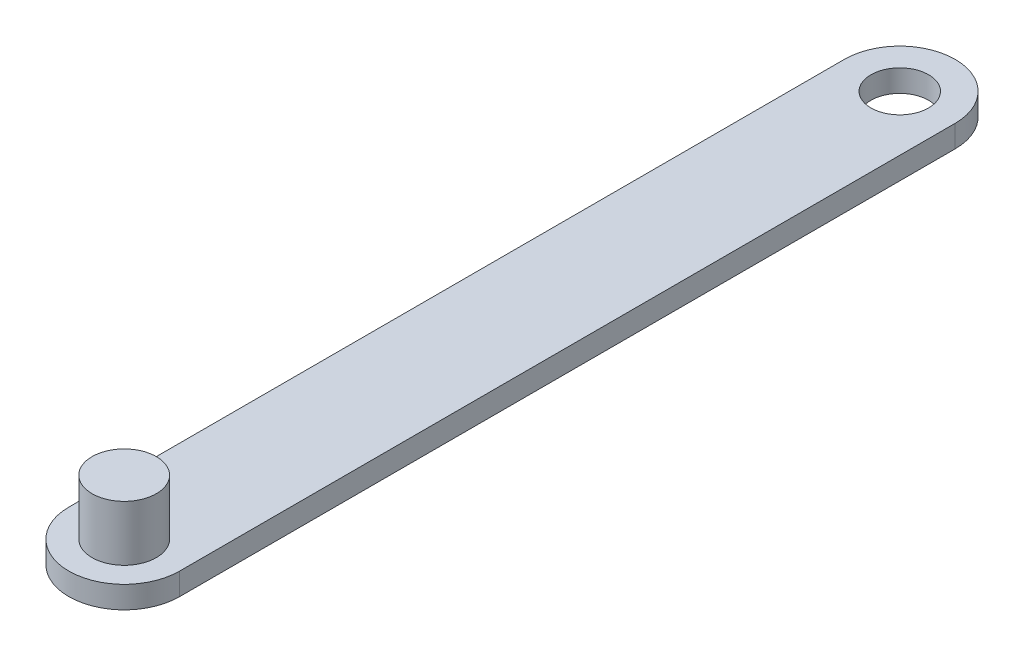
ISO-10303-21;
HEADER;
FILE_DESCRIPTION(('STEP AP214'),'2;1');
FILE_NAME('part.step','',(''),(''),'','','');
FILE_SCHEMA(('AUTOMOTIVE_DESIGN { 1 0 10303 214 1 1 1 1 }'));
ENDSEC;
DATA;
#1=APPLICATION_CONTEXT('core data for automotive mechanical design processes');
#2=APPLICATION_PROTOCOL_DEFINITION('international standard','automotive_design',2000,#1);
#3=PRODUCT_CONTEXT('',#1,'mechanical');
#4=PRODUCT('Part','Part','',(#3));
#5=PRODUCT_RELATED_PRODUCT_CATEGORY('part','',(#4));
#6=PRODUCT_DEFINITION_FORMATION('','',#4);
#7=PRODUCT_DEFINITION_CONTEXT('part definition',#1,'design');
#8=PRODUCT_DEFINITION('design','',#6,#7);
#9=PRODUCT_DEFINITION_SHAPE('','',#8);
#10=(LENGTH_UNIT() NAMED_UNIT(*) SI_UNIT(.MILLI.,.METRE.));
#11=(NAMED_UNIT(*) PLANE_ANGLE_UNIT() SI_UNIT($,.RADIAN.));
#12=(NAMED_UNIT(*) SI_UNIT($,.STERADIAN.) SOLID_ANGLE_UNIT());
#13=UNCERTAINTY_MEASURE_WITH_UNIT(LENGTH_MEASURE(1.E-05),#10,'distance_accuracy_value','');
#14=(GEOMETRIC_REPRESENTATION_CONTEXT(3) GLOBAL_UNCERTAINTY_ASSIGNED_CONTEXT((#13)) GLOBAL_UNIT_ASSIGNED_CONTEXT((#10,
#11,#12)) REPRESENTATION_CONTEXT('',''));
#15=CARTESIAN_POINT('',(0.,0.,0.));
#16=DIRECTION('',(0.,0.,1.));
#17=DIRECTION('',(1.,0.,0.));
#18=AXIS2_PLACEMENT_3D('',#15,#16,#17);
#19=CARTESIAN_POINT('',(5.,2.,0.));
#20=DIRECTION('',(0.,-1.,0.));
#21=DIRECTION('',(0.,0.,-1.));
#22=AXIS2_PLACEMENT_3D('',#19,#20,#21);
#23=CYLINDRICAL_SURFACE('',#22,5.);
#24=CARTESIAN_POINT('',(5.,0.,0.));
#25=DIRECTION('',(0.,1.,0.));
#26=DIRECTION('',(0.,0.,1.));
#27=AXIS2_PLACEMENT_3D('',#24,#25,#26);
#28=CIRCLE('',#27,5.);
#29=CARTESIAN_POINT('',(0.,0.,0.));
#30=VERTEX_POINT('',#29);
#31=CARTESIAN_POINT('',(10.,0.,0.));
#32=VERTEX_POINT('',#31);
#33=EDGE_CURVE('E102',#30,#32,#28,.T.);
#34=ORIENTED_EDGE('',*,*,#33,.T.);
#35=DIRECTION('',(0.,-1.,0.));
#36=VECTOR('',#35,1.);
#37=CARTESIAN_POINT('',(10.,2.,0.));
#38=LINE('',#37,#36);
#39=CARTESIAN_POINT('',(10.,2.,0.));
#40=VERTEX_POINT('',#39);
#41=EDGE_CURVE('E11',#40,#32,#38,.T.);
#42=ORIENTED_EDGE('',*,*,#41,.F.);
#43=CARTESIAN_POINT('',(5.,2.,0.));
#44=DIRECTION('',(0.,1.,0.));
#45=DIRECTION('',(0.,0.,1.));
#46=AXIS2_PLACEMENT_3D('',#43,#44,#45);
#47=CIRCLE('',#46,5.);
#48=CARTESIAN_POINT('',(0.,2.,0.));
#49=VERTEX_POINT('',#48);
#50=EDGE_CURVE('E90',#49,#40,#47,.T.);
#51=ORIENTED_EDGE('',*,*,#50,.F.);
#52=DIRECTION('',(0.,-1.,0.));
#53=VECTOR('',#52,1.);
#54=CARTESIAN_POINT('',(0.,2.,0.));
#55=LINE('',#54,#53);
#56=EDGE_CURVE('E98',#49,#30,#55,.T.);
#57=ORIENTED_EDGE('',*,*,#56,.T.);
#58=EDGE_LOOP('',(#34,#42,#51,#57));
#59=FACE_BOUND('',#58,.T.);
#60=ADVANCED_FACE('F39',(#59),#23,.T.);
#61=CARTESIAN_POINT('',(10.,2.,0.));
#62=DIRECTION('',(-1.,0.,0.));
#63=DIRECTION('',(0.,0.,1.));
#64=AXIS2_PLACEMENT_3D('',#61,#62,#63);
#65=PLANE('',#64);
#66=DIRECTION('',(0.,0.,-1.));
#67=VECTOR('',#66,1.);
#68=CARTESIAN_POINT('',(10.,0.,0.));
#69=LINE('',#68,#67);
#70=CARTESIAN_POINT('',(10.,0.,-70.0050477828094));
#71=VERTEX_POINT('',#70);
#72=EDGE_CURVE('E94',#32,#71,#69,.T.);
#73=ORIENTED_EDGE('',*,*,#72,.T.);
#74=DIRECTION('',(0.,-1.,0.));
#75=VECTOR('',#74,1.);
#76=CARTESIAN_POINT('',(10.,2.,-70.0050477828094));
#77=LINE('',#76,#75);
#78=CARTESIAN_POINT('',(10.,2.,-70.0050477828094));
#79=VERTEX_POINT('',#78);
#80=EDGE_CURVE('E47',#79,#71,#77,.T.);
#81=ORIENTED_EDGE('',*,*,#80,.F.);
#82=DIRECTION('',(0.,0.,-1.));
#83=VECTOR('',#82,1.);
#84=CARTESIAN_POINT('',(10.,2.,0.));
#85=LINE('',#84,#83);
#86=EDGE_CURVE('E85',#40,#79,#85,.T.);
#87=ORIENTED_EDGE('',*,*,#86,.F.);
#88=ORIENTED_EDGE('',*,*,#41,.T.);
#89=EDGE_LOOP('',(#73,#81,#87,#88));
#90=FACE_BOUND('',#89,.T.);
#91=ADVANCED_FACE('F93',(#90),#65,.F.);
#92=CARTESIAN_POINT('',(5.,2.,-70.0025238914047));
#93=DIRECTION('',(0.,-1.,0.));
#94=DIRECTION('',(0.,0.,-1.));
#95=AXIS2_PLACEMENT_3D('',#92,#93,#94);
#96=CYLINDRICAL_SURFACE('',#95,5.00000063700274);
#97=CARTESIAN_POINT('',(5.,0.,-70.0025238914047));
#98=DIRECTION('',(0.,1.,0.));
#99=DIRECTION('',(0.,0.,1.));
#100=AXIS2_PLACEMENT_3D('',#97,#98,#99);
#101=CIRCLE('',#100,5.00000063700274);
#102=CARTESIAN_POINT('',(0.,0.,-70.));
#103=VERTEX_POINT('',#102);
#104=EDGE_CURVE('E72',#71,#103,#101,.T.);
#105=ORIENTED_EDGE('',*,*,#104,.T.);
#106=DIRECTION('',(0.,-1.,0.));
#107=VECTOR('',#106,1.);
#108=CARTESIAN_POINT('',(0.,2.,-70.));
#109=LINE('',#108,#107);
#110=CARTESIAN_POINT('',(0.,2.,-70.));
#111=VERTEX_POINT('',#110);
#112=EDGE_CURVE('E95',#111,#103,#109,.T.);
#113=ORIENTED_EDGE('',*,*,#112,.F.);
#114=CARTESIAN_POINT('',(5.,2.,-70.0025238914047));
#115=DIRECTION('',(0.,1.,0.));
#116=DIRECTION('',(0.,0.,1.));
#117=AXIS2_PLACEMENT_3D('',#114,#115,#116);
#118=CIRCLE('',#117,5.00000063700274);
#119=EDGE_CURVE('E88',#79,#111,#118,.T.);
#120=ORIENTED_EDGE('',*,*,#119,.F.);
#121=ORIENTED_EDGE('',*,*,#80,.T.);
#122=EDGE_LOOP('',(#105,#113,#120,#121));
#123=FACE_BOUND('',#122,.T.);
#124=ADVANCED_FACE('F96',(#123),#96,.T.);
#125=CARTESIAN_POINT('',(0.,2.,0.));
#126=DIRECTION('',(1.,0.,0.));
#127=DIRECTION('',(0.,0.,-1.));
#128=AXIS2_PLACEMENT_3D('',#125,#126,#127);
#129=PLANE('',#128);
#130=DIRECTION('',(0.,0.,1.));
#131=VECTOR('',#130,1.);
#132=CARTESIAN_POINT('',(0.,0.,0.));
#133=LINE('',#132,#131);
#134=EDGE_CURVE('E78',#103,#30,#133,.T.);
#135=ORIENTED_EDGE('',*,*,#134,.T.);
#136=ORIENTED_EDGE('',*,*,#56,.F.);
#137=DIRECTION('',(0.,0.,1.));
#138=VECTOR('',#137,1.);
#139=CARTESIAN_POINT('',(0.,2.,0.));
#140=LINE('',#139,#138);
#141=EDGE_CURVE('E55',#111,#49,#140,.T.);
#142=ORIENTED_EDGE('',*,*,#141,.F.);
#143=ORIENTED_EDGE('',*,*,#112,.T.);
#144=EDGE_LOOP('',(#135,#136,#142,#143));
#145=FACE_BOUND('',#144,.T.);
#146=ADVANCED_FACE('F110',(#145),#129,.F.);
#147=CARTESIAN_POINT('',(5.,2.,0.));
#148=DIRECTION('',(0.,1.,0.));
#149=DIRECTION('',(0.,0.,1.));
#150=AXIS2_PLACEMENT_3D('',#147,#148,#149);
#151=PLANE('',#150);
#152=CARTESIAN_POINT('',(5.,2.,0.));
#153=DIRECTION('',(0.,1.,0.));
#154=DIRECTION('',(0.,0.,1.));
#155=AXIS2_PLACEMENT_3D('',#152,#153,#154);
#156=CIRCLE('',#155,2.9);
#157=CARTESIAN_POINT('',(5.,2.,2.9));
#158=VERTEX_POINT('',#157);
#159=EDGE_CURVE('E122',#158,#158,#156,.T.);
#160=ORIENTED_EDGE('',*,*,#159,.F.);
#161=EDGE_LOOP('',(#160));
#162=FACE_BOUND('',#161,.T.);
#163=CARTESIAN_POINT('',(5.,2.,-70.));
#164=DIRECTION('',(0.,1.,0.));
#165=DIRECTION('',(0.,0.,1.));
#166=AXIS2_PLACEMENT_3D('',#163,#164,#165);
#167=CIRCLE('',#166,2.6);
#168=CARTESIAN_POINT('',(5.,2.,-67.4));
#169=VERTEX_POINT('',#168);
#170=EDGE_CURVE('E116',#169,#169,#167,.T.);
#171=ORIENTED_EDGE('',*,*,#170,.F.);
#172=EDGE_LOOP('',(#171));
#173=FACE_BOUND('',#172,.T.);
#174=ORIENTED_EDGE('',*,*,#50,.T.);
#175=ORIENTED_EDGE('',*,*,#86,.T.);
#176=ORIENTED_EDGE('',*,*,#119,.T.);
#177=ORIENTED_EDGE('',*,*,#141,.T.);
#178=EDGE_LOOP('',(#174,#175,#176,#177));
#179=FACE_BOUND('',#178,.T.);
#180=ADVANCED_FACE('F86',(#162,#173,#179),#151,.T.);
#181=CARTESIAN_POINT('',(5.,0.,0.));
#182=DIRECTION('',(0.,1.,0.));
#183=DIRECTION('',(0.,0.,1.));
#184=AXIS2_PLACEMENT_3D('',#181,#182,#183);
#185=PLANE('',#184);
#186=CARTESIAN_POINT('',(5.,0.,-70.));
#187=DIRECTION('',(0.,1.,0.));
#188=DIRECTION('',(0.,0.,1.));
#189=AXIS2_PLACEMENT_3D('',#186,#187,#188);
#190=CIRCLE('',#189,2.6);
#191=CARTESIAN_POINT('',(5.,0.,-67.4));
#192=VERTEX_POINT('',#191);
#193=EDGE_CURVE('E105',#192,#192,#190,.T.);
#194=ORIENTED_EDGE('',*,*,#193,.T.);
#195=EDGE_LOOP('',(#194));
#196=FACE_BOUND('',#195,.T.);
#197=ORIENTED_EDGE('',*,*,#33,.F.);
#198=ORIENTED_EDGE('',*,*,#134,.F.);
#199=ORIENTED_EDGE('',*,*,#104,.F.);
#200=ORIENTED_EDGE('',*,*,#72,.F.);
#201=EDGE_LOOP('',(#197,#198,#199,#200));
#202=FACE_BOUND('',#201,.T.);
#203=ADVANCED_FACE('F113',(#196,#202),#185,.F.);
#204=CARTESIAN_POINT('',(5.,0.,-70.));
#205=DIRECTION('',(0.,1.,0.));
#206=DIRECTION('',(0.,0.,1.));
#207=AXIS2_PLACEMENT_3D('',#204,#205,#206);
#208=CYLINDRICAL_SURFACE('',#207,2.6);
#209=ORIENTED_EDGE('',*,*,#193,.F.);
#210=EDGE_LOOP('',(#209));
#211=FACE_BOUND('',#210,.T.);
#212=ORIENTED_EDGE('',*,*,#170,.T.);
#213=EDGE_LOOP('',(#212));
#214=FACE_BOUND('',#213,.T.);
#215=ADVANCED_FACE('F133',(#211,#214),#208,.F.);
#216=CARTESIAN_POINT('',(5.,7.,0.));
#217=DIRECTION('',(0.,-1.,0.));
#218=DIRECTION('',(0.,0.,-1.));
#219=AXIS2_PLACEMENT_3D('',#216,#217,#218);
#220=CYLINDRICAL_SURFACE('',#219,2.9);
#221=CARTESIAN_POINT('',(5.,7.,0.));
#222=DIRECTION('',(0.,1.,0.));
#223=DIRECTION('',(0.,0.,1.));
#224=AXIS2_PLACEMENT_3D('',#221,#222,#223);
#225=CIRCLE('',#224,2.9);
#226=CARTESIAN_POINT('',(5.,7.,2.9));
#227=VERTEX_POINT('',#226);
#228=EDGE_CURVE('E119',#227,#227,#225,.T.);
#229=ORIENTED_EDGE('',*,*,#228,.F.);
#230=EDGE_LOOP('',(#229));
#231=FACE_BOUND('',#230,.T.);
#232=ORIENTED_EDGE('',*,*,#159,.T.);
#233=EDGE_LOOP('',(#232));
#234=FACE_BOUND('',#233,.T.);
#235=ADVANCED_FACE('F130',(#231,#234),#220,.T.);
#236=CARTESIAN_POINT('',(5.,7.,0.));
#237=DIRECTION('',(0.,1.,0.));
#238=DIRECTION('',(0.,0.,1.));
#239=AXIS2_PLACEMENT_3D('',#236,#237,#238);
#240=PLANE('',#239);
#241=ORIENTED_EDGE('',*,*,#228,.T.);
#242=EDGE_LOOP('',(#241));
#243=FACE_BOUND('',#242,.T.);
#244=ADVANCED_FACE('F128',(#243),#240,.T.);
#245=CLOSED_SHELL('',(#60,#91,#124,#146,#180,#203,#215,#235,#244));
#246=MANIFOLD_SOLID_BREP('B2',#245);
#247=ADVANCED_BREP_SHAPE_REPRESENTATION('',(#18,#246),#14);
#248=SHAPE_DEFINITION_REPRESENTATION(#9,#247);
ENDSEC;
END-ISO-10303-21;
